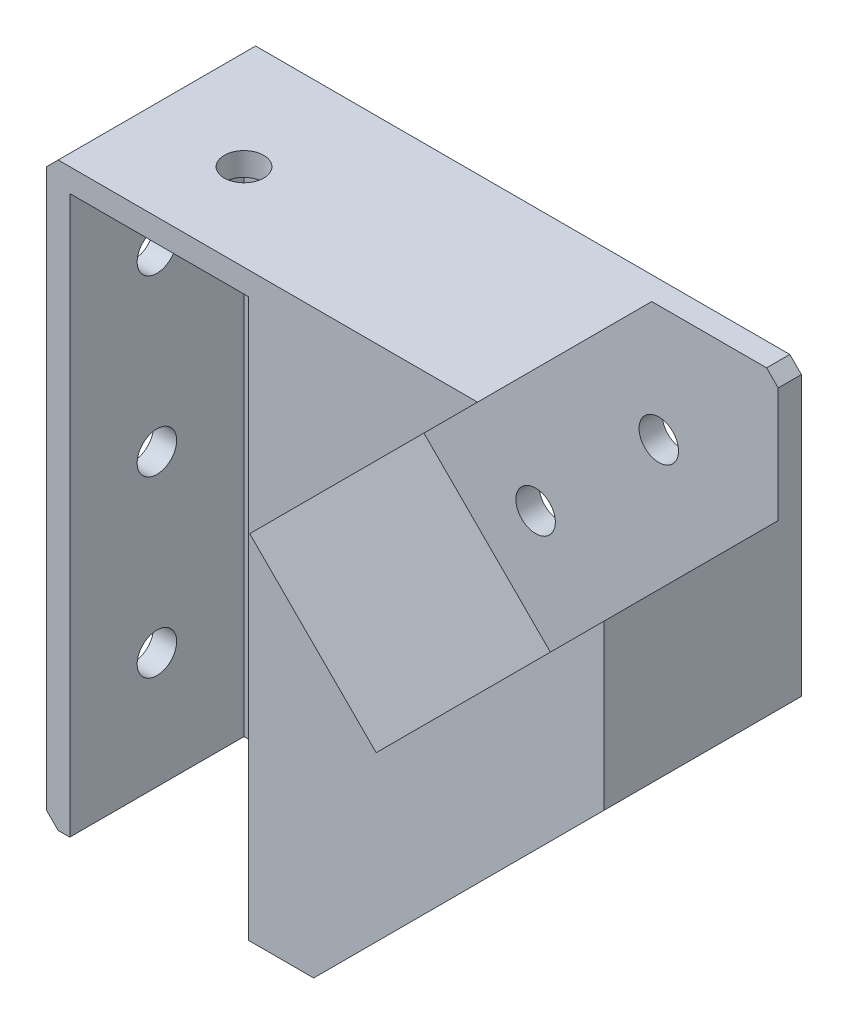
ISO-10303-21;
HEADER;
FILE_DESCRIPTION(('STEP AP214'),'2;1');
FILE_NAME('part.step','',(''),(''),'','','');
FILE_SCHEMA(('AUTOMOTIVE_DESIGN { 1 0 10303 214 1 1 1 1 }'));
ENDSEC;
DATA;
#1=APPLICATION_CONTEXT('core data for automotive mechanical design processes');
#2=APPLICATION_PROTOCOL_DEFINITION('international standard','automotive_design',2000,#1);
#3=PRODUCT_CONTEXT('',#1,'mechanical');
#4=PRODUCT('Part','Part','',(#3));
#5=PRODUCT_RELATED_PRODUCT_CATEGORY('part','',(#4));
#6=PRODUCT_DEFINITION_FORMATION('','',#4);
#7=PRODUCT_DEFINITION_CONTEXT('part definition',#1,'design');
#8=PRODUCT_DEFINITION('design','',#6,#7);
#9=PRODUCT_DEFINITION_SHAPE('','',#8);
#10=(LENGTH_UNIT() NAMED_UNIT(*) SI_UNIT(.MILLI.,.METRE.));
#11=(NAMED_UNIT(*) PLANE_ANGLE_UNIT() SI_UNIT($,.RADIAN.));
#12=(NAMED_UNIT(*) SI_UNIT($,.STERADIAN.) SOLID_ANGLE_UNIT());
#13=UNCERTAINTY_MEASURE_WITH_UNIT(LENGTH_MEASURE(1.E-05),#10,'distance_accuracy_value','');
#14=(GEOMETRIC_REPRESENTATION_CONTEXT(3) GLOBAL_UNCERTAINTY_ASSIGNED_CONTEXT((#13)) GLOBAL_UNIT_ASSIGNED_CONTEXT((#10,
#11,#12)) REPRESENTATION_CONTEXT('',''));
#15=CARTESIAN_POINT('',(0.,0.,0.));
#16=DIRECTION('',(0.,0.,1.));
#17=DIRECTION('',(1.,0.,0.));
#18=AXIS2_PLACEMENT_3D('',#15,#16,#17);
#19=CARTESIAN_POINT('',(24.,15.1105555697272,2.));
#20=DIRECTION('',(0.707106781186548,-0.707106781186547,0.));
#21=DIRECTION('',(0.707106781186547,0.707106781186548,0.));
#22=AXIS2_PLACEMENT_3D('',#19,#20,#21);
#23=PLANE('',#22);
#24=DIRECTION('',(0.707106781186547,0.707106781186548,0.));
#25=VECTOR('',#24,1.);
#26=CARTESIAN_POINT('',(24.,15.1105555697272,17.));
#27=LINE('',#26,#25);
#28=CARTESIAN_POINT('',(4.38153172576223,-4.50791270451062,17.));
#29=VERTEX_POINT('',#28);
#30=CARTESIAN_POINT('',(24.,15.1105555697272,17.));
#31=VERTEX_POINT('',#30);
#32=EDGE_CURVE('E157',#29,#31,#27,.T.);
#33=ORIENTED_EDGE('',*,*,#32,.T.);
#34=DIRECTION('',(0.,0.,1.));
#35=VECTOR('',#34,1.);
#36=CARTESIAN_POINT('',(24.,15.1105555697272,2.));
#37=LINE('',#36,#35);
#38=CARTESIAN_POINT('',(24.,15.1105555697272,2.));
#39=VERTEX_POINT('',#38);
#40=EDGE_CURVE('E192',#39,#31,#37,.T.);
#41=ORIENTED_EDGE('',*,*,#40,.F.);
#42=DIRECTION('',(0.707106781186547,0.707106781186548,0.));
#43=VECTOR('',#42,1.);
#44=CARTESIAN_POINT('',(24.,15.1105555697272,2.));
#45=LINE('',#44,#43);
#46=CARTESIAN_POINT('',(4.38153172576223,-4.50791270451062,2.));
#47=VERTEX_POINT('',#46);
#48=EDGE_CURVE('E178',#47,#39,#45,.T.);
#49=ORIENTED_EDGE('',*,*,#48,.F.);
#50=DIRECTION('',(0.,0.,1.));
#51=VECTOR('',#50,1.);
#52=CARTESIAN_POINT('',(4.38153172576223,-4.50791270451062,2.));
#53=LINE('',#52,#51);
#54=EDGE_CURVE('E176',#47,#29,#53,.T.);
#55=ORIENTED_EDGE('',*,*,#54,.T.);
#56=EDGE_LOOP('',(#33,#41,#49,#55));
#57=FACE_BOUND('',#56,.T.);
#58=CARTESIAN_POINT('',(9.87365440327096,0.984209972998115,9.5));
#59=DIRECTION('',(0.707106781186548,-0.707106781186547,0.));
#60=DIRECTION('',(0.707106781186547,0.707106781186548,0.));
#61=AXIS2_PLACEMENT_3D('',#58,#59,#60);
#62=CIRCLE('',#61,1.7);
#63=CARTESIAN_POINT('',(11.0757359312881,2.18629150101525,9.5));
#64=VERTEX_POINT('',#63);
#65=EDGE_CURVE('E440',#64,#64,#62,.F.);
#66=ORIENTED_EDGE('',*,*,#65,.F.);
#67=EDGE_LOOP('',(#66));
#68=FACE_BOUND('',#67,.T.);
#69=ADVANCED_FACE('F33',(#57,#68),#23,.F.);
#70=CARTESIAN_POINT('',(0.,0.,2.));
#71=DIRECTION('',(0.,0.,1.));
#72=DIRECTION('',(1.,0.,0.));
#73=AXIS2_PLACEMENT_3D('',#70,#71,#72);
#74=PLANE('',#73);
#75=CARTESIAN_POINT('',(-14.5,16.,2.));
#76=DIRECTION('',(0.,0.,1.));
#77=DIRECTION('',(1.,0.,0.));
#78=AXIS2_PLACEMENT_3D('',#75,#76,#77);
#79=CIRCLE('',#78,1.7);
#80=CARTESIAN_POINT('',(-12.8,16.,2.));
#81=VERTEX_POINT('',#80);
#82=EDGE_CURVE('E460',#81,#81,#79,.T.);
#83=ORIENTED_EDGE('',*,*,#82,.F.);
#84=EDGE_LOOP('',(#83));
#85=FACE_BOUND('',#84,.T.);
#86=CARTESIAN_POINT('',(-14.5,0.999999999999996,2.));
#87=DIRECTION('',(0.,0.,1.));
#88=DIRECTION('',(1.,0.,0.));
#89=AXIS2_PLACEMENT_3D('',#86,#87,#88);
#90=CIRCLE('',#89,1.7);
#91=CARTESIAN_POINT('',(-12.8,0.999999999999996,2.));
#92=VERTEX_POINT('',#91);
#93=EDGE_CURVE('E466',#92,#92,#90,.T.);
#94=ORIENTED_EDGE('',*,*,#93,.F.);
#95=EDGE_LOOP('',(#94));
#96=FACE_BOUND('',#95,.T.);
#97=CARTESIAN_POINT('',(-14.5,-14.,2.));
#98=DIRECTION('',(0.,0.,1.));
#99=DIRECTION('',(1.,0.,0.));
#100=AXIS2_PLACEMENT_3D('',#97,#98,#99);
#101=CIRCLE('',#100,1.7);
#102=CARTESIAN_POINT('',(-12.8,-14.,2.));
#103=VERTEX_POINT('',#102);
#104=EDGE_CURVE('E472',#103,#103,#101,.T.);
#105=ORIENTED_EDGE('',*,*,#104,.F.);
#106=EDGE_LOOP('',(#105));
#107=FACE_BOUND('',#106,.T.);
#108=DIRECTION('',(1.,0.,0.));
#109=VECTOR('',#108,1.);
#110=CARTESIAN_POINT('',(-24.,-24.,2.));
#111=LINE('',#110,#109);
#112=CARTESIAN_POINT('',(-22.,-24.,2.));
#113=VERTEX_POINT('',#112);
#114=CARTESIAN_POINT('',(-6.59999999999998,-24.,2.));
#115=VERTEX_POINT('',#114);
#116=EDGE_CURVE('E218',#113,#115,#111,.T.);
#117=ORIENTED_EDGE('',*,*,#116,.T.);
#118=DIRECTION('',(0.,-1.,0.));
#119=VECTOR('',#118,1.);
#120=CARTESIAN_POINT('',(-6.59999999999998,-24.,2.));
#121=LINE('',#120,#119);
#122=CARTESIAN_POINT('',(-6.59999999999998,24.,2.));
#123=VERTEX_POINT('',#122);
#124=EDGE_CURVE('E197',#123,#115,#121,.T.);
#125=ORIENTED_EDGE('',*,*,#124,.F.);
#126=DIRECTION('',(-1.,0.,0.));
#127=VECTOR('',#126,1.);
#128=CARTESIAN_POINT('',(-24.,24.,2.));
#129=LINE('',#128,#127);
#130=CARTESIAN_POINT('',(-22.,24.,2.));
#131=VERTEX_POINT('',#130);
#132=EDGE_CURVE('E230',#123,#131,#129,.T.);
#133=ORIENTED_EDGE('',*,*,#132,.T.);
#134=DIRECTION('',(0.,1.,0.));
#135=VECTOR('',#134,1.);
#136=CARTESIAN_POINT('',(-22.,-24.,2.));
#137=LINE('',#136,#135);
#138=EDGE_CURVE('E203',#113,#131,#137,.T.);
#139=ORIENTED_EDGE('',*,*,#138,.F.);
#140=EDGE_LOOP('',(#117,#125,#133,#139));
#141=FACE_BOUND('',#140,.T.);
#142=ADVANCED_FACE('F304',(#85,#96,#107,#141),#74,.T.);
#143=CARTESIAN_POINT('',(24.,24.,2.));
#144=DIRECTION('',(-1.,0.,0.));
#145=DIRECTION('',(0.,-1.,0.));
#146=AXIS2_PLACEMENT_3D('',#143,#144,#145);
#147=PLANE('',#146);
#148=DIRECTION('',(0.,-1.,0.));
#149=VECTOR('',#148,1.);
#150=CARTESIAN_POINT('',(24.,26.,17.));
#151=LINE('',#150,#149);
#152=CARTESIAN_POINT('',(24.,0.999999999999987,17.));
#153=VERTEX_POINT('',#152);
#154=EDGE_CURVE('E186',#31,#153,#151,.T.);
#155=ORIENTED_EDGE('',*,*,#154,.T.);
#156=DIRECTION('',(0.,0.,-1.));
#157=VECTOR('',#156,1.);
#158=CARTESIAN_POINT('',(24.,0.99999999999999,2.));
#159=LINE('',#158,#157);
#160=CARTESIAN_POINT('',(24.,0.999999999999988,0.));
#161=VERTEX_POINT('',#160);
#162=EDGE_CURVE('E271',#153,#161,#159,.T.);
#163=ORIENTED_EDGE('',*,*,#162,.T.);
#164=DIRECTION('',(0.,1.,0.));
#165=VECTOR('',#164,1.);
#166=CARTESIAN_POINT('',(24.,24.,0.));
#167=LINE('',#166,#165);
#168=CARTESIAN_POINT('',(24.,25.,0.));
#169=VERTEX_POINT('',#168);
#170=EDGE_CURVE('E227',#161,#169,#167,.T.);
#171=ORIENTED_EDGE('',*,*,#170,.T.);
#172=DIRECTION('',(0.,0.,1.));
#173=VECTOR('',#172,1.);
#174=CARTESIAN_POINT('',(24.,25.,2.));
#175=LINE('',#174,#173);
#176=CARTESIAN_POINT('',(24.,25.,2.));
#177=VERTEX_POINT('',#176);
#178=EDGE_CURVE('E251',#169,#177,#175,.T.);
#179=ORIENTED_EDGE('',*,*,#178,.T.);
#180=DIRECTION('',(0.,1.,0.));
#181=VECTOR('',#180,1.);
#182=CARTESIAN_POINT('',(24.,26.,2.));
#183=LINE('',#182,#181);
#184=EDGE_CURVE('E174',#39,#177,#183,.T.);
#185=ORIENTED_EDGE('',*,*,#184,.F.);
#186=ORIENTED_EDGE('',*,*,#40,.T.);
#187=EDGE_LOOP('',(#155,#163,#171,#179,#185,#186));
#188=FACE_BOUND('',#187,.T.);
#189=ADVANCED_FACE('F277',(#188),#147,.F.);
#190=CARTESIAN_POINT('',(-24.,24.,2.));
#191=DIRECTION('',(1.,0.,0.));
#192=DIRECTION('',(0.,1.,0.));
#193=AXIS2_PLACEMENT_3D('',#190,#191,#192);
#194=PLANE('',#193);
#195=CARTESIAN_POINT('',(-24.,-14.,9.5));
#196=DIRECTION('',(-1.,0.,0.));
#197=DIRECTION('',(0.,0.,1.));
#198=AXIS2_PLACEMENT_3D('',#195,#196,#197);
#199=CIRCLE('',#198,1.69999999999999);
#200=CARTESIAN_POINT('',(-24.,-14.,11.2));
#201=VERTEX_POINT('',#200);
#202=EDGE_CURVE('E422',#201,#201,#199,.T.);
#203=ORIENTED_EDGE('',*,*,#202,.F.);
#204=EDGE_LOOP('',(#203));
#205=FACE_BOUND('',#204,.T.);
#206=CARTESIAN_POINT('',(-24.,0.999999999999996,9.5));
#207=DIRECTION('',(-1.,0.,0.));
#208=DIRECTION('',(0.,0.,1.));
#209=AXIS2_PLACEMENT_3D('',#206,#207,#208);
#210=CIRCLE('',#209,1.69999999999999);
#211=CARTESIAN_POINT('',(-24.,0.999999999999996,11.2));
#212=VERTEX_POINT('',#211);
#213=EDGE_CURVE('E425',#212,#212,#210,.T.);
#214=ORIENTED_EDGE('',*,*,#213,.F.);
#215=EDGE_LOOP('',(#214));
#216=FACE_BOUND('',#215,.T.);
#217=CARTESIAN_POINT('',(-24.,16.,9.5));
#218=DIRECTION('',(-1.,0.,0.));
#219=DIRECTION('',(0.,0.,1.));
#220=AXIS2_PLACEMENT_3D('',#217,#218,#219);
#221=CIRCLE('',#220,1.69999999999999);
#222=CARTESIAN_POINT('',(-24.,16.,11.2));
#223=VERTEX_POINT('',#222);
#224=EDGE_CURVE('E433',#223,#223,#221,.T.);
#225=ORIENTED_EDGE('',*,*,#224,.F.);
#226=EDGE_LOOP('',(#225));
#227=FACE_BOUND('',#226,.T.);
#228=DIRECTION('',(0.,-1.,0.));
#229=VECTOR('',#228,1.);
#230=CARTESIAN_POINT('',(-24.,24.,0.));
#231=LINE('',#230,#229);
#232=CARTESIAN_POINT('',(-24.,25.,0.));
#233=VERTEX_POINT('',#232);
#234=CARTESIAN_POINT('',(-24.,-23.,0.));
#235=VERTEX_POINT('',#234);
#236=EDGE_CURVE('E285',#233,#235,#231,.T.);
#237=ORIENTED_EDGE('',*,*,#236,.T.);
#238=DIRECTION('',(0.,0.,1.));
#239=VECTOR('',#238,1.);
#240=CARTESIAN_POINT('',(-24.,-23.,2.));
#241=LINE('',#240,#239);
#242=CARTESIAN_POINT('',(-24.,-23.,17.));
#243=VERTEX_POINT('',#242);
#244=EDGE_CURVE('E267',#235,#243,#241,.T.);
#245=ORIENTED_EDGE('',*,*,#244,.T.);
#246=DIRECTION('',(0.,-1.,0.));
#247=VECTOR('',#246,1.);
#248=CARTESIAN_POINT('',(-24.,-24.,17.));
#249=LINE('',#248,#247);
#250=CARTESIAN_POINT('',(-24.,25.,17.));
#251=VERTEX_POINT('',#250);
#252=EDGE_CURVE('E204',#251,#243,#249,.T.);
#253=ORIENTED_EDGE('',*,*,#252,.F.);
#254=DIRECTION('',(0.,0.,-1.));
#255=VECTOR('',#254,1.);
#256=CARTESIAN_POINT('',(-24.,25.,0.));
#257=LINE('',#256,#255);
#258=EDGE_CURVE('E258',#251,#233,#257,.T.);
#259=ORIENTED_EDGE('',*,*,#258,.T.);
#260=EDGE_LOOP('',(#237,#245,#253,#259));
#261=FACE_BOUND('',#260,.T.);
#262=ADVANCED_FACE('F316',(#205,#216,#227,#261),#194,.F.);
#263=CARTESIAN_POINT('',(-24.,-24.,2.));
#264=DIRECTION('',(0.,1.,0.));
#265=DIRECTION('',(0.,0.,1.));
#266=AXIS2_PLACEMENT_3D('',#263,#264,#265);
#267=PLANE('',#266);
#268=DIRECTION('',(1.,0.,0.));
#269=VECTOR('',#268,1.);
#270=CARTESIAN_POINT('',(-24.,-24.,0.));
#271=LINE('',#270,#269);
#272=CARTESIAN_POINT('',(-23.,-24.,0.));
#273=VERTEX_POINT('',#272);
#274=CARTESIAN_POINT('',(-1.00000000000007,-24.,0.));
#275=VERTEX_POINT('',#274);
#276=EDGE_CURVE('E233',#273,#275,#271,.T.);
#277=ORIENTED_EDGE('',*,*,#276,.T.);
#278=DIRECTION('',(0.,0.,1.));
#279=VECTOR('',#278,1.);
#280=CARTESIAN_POINT('',(-1.00000000000007,-24.,2.));
#281=LINE('',#280,#279);
#282=CARTESIAN_POINT('',(-1.00000000000008,-24.,17.));
#283=VERTEX_POINT('',#282);
#284=EDGE_CURVE('E41',#275,#283,#281,.T.);
#285=ORIENTED_EDGE('',*,*,#284,.T.);
#286=DIRECTION('',(1.,0.,0.));
#287=VECTOR('',#286,1.);
#288=CARTESIAN_POINT('',(-6.59999999999998,-24.,17.));
#289=LINE('',#288,#287);
#290=CARTESIAN_POINT('',(-6.59999999999998,-24.,17.));
#291=VERTEX_POINT('',#290);
#292=EDGE_CURVE('E193',#291,#283,#289,.T.);
#293=ORIENTED_EDGE('',*,*,#292,.F.);
#294=DIRECTION('',(0.,0.,-1.));
#295=VECTOR('',#294,1.);
#296=CARTESIAN_POINT('',(-6.59999999999998,-24.,17.));
#297=LINE('',#296,#295);
#298=EDGE_CURVE('E200',#291,#115,#297,.T.);
#299=ORIENTED_EDGE('',*,*,#298,.T.);
#300=ORIENTED_EDGE('',*,*,#116,.F.);
#301=DIRECTION('',(0.,0.,-1.));
#302=VECTOR('',#301,1.);
#303=CARTESIAN_POINT('',(-22.,-24.,17.));
#304=LINE('',#303,#302);
#305=CARTESIAN_POINT('',(-22.,-24.,17.));
#306=VERTEX_POINT('',#305);
#307=EDGE_CURVE('E222',#306,#113,#304,.T.);
#308=ORIENTED_EDGE('',*,*,#307,.F.);
#309=DIRECTION('',(1.,0.,0.));
#310=VECTOR('',#309,1.);
#311=CARTESIAN_POINT('',(-24.,-24.,17.));
#312=LINE('',#311,#310);
#313=CARTESIAN_POINT('',(-23.,-24.,17.));
#314=VERTEX_POINT('',#313);
#315=EDGE_CURVE('E207',#314,#306,#312,.T.);
#316=ORIENTED_EDGE('',*,*,#315,.F.);
#317=DIRECTION('',(0.,0.,-1.));
#318=VECTOR('',#317,1.);
#319=CARTESIAN_POINT('',(-23.,-24.,2.));
#320=LINE('',#319,#318);
#321=EDGE_CURVE('E262',#314,#273,#320,.T.);
#322=ORIENTED_EDGE('',*,*,#321,.T.);
#323=EDGE_LOOP('',(#277,#285,#293,#299,#300,#308,#316,#322));
#324=FACE_BOUND('',#323,.T.);
#325=ADVANCED_FACE('F290',(#324),#267,.F.);
#326=CARTESIAN_POINT('',(0.,0.,0.));
#327=DIRECTION('',(0.,0.,1.));
#328=DIRECTION('',(1.,0.,0.));
#329=AXIS2_PLACEMENT_3D('',#326,#327,#328);
#330=PLANE('',#329);
#331=CARTESIAN_POINT('',(-14.5,16.,0.));
#332=DIRECTION('',(0.,0.,1.));
#333=DIRECTION('',(1.,0.,0.));
#334=AXIS2_PLACEMENT_3D('',#331,#332,#333);
#335=CIRCLE('',#334,1.7);
#336=CARTESIAN_POINT('',(-12.8,16.,0.));
#337=VERTEX_POINT('',#336);
#338=EDGE_CURVE('E463',#337,#337,#335,.T.);
#339=ORIENTED_EDGE('',*,*,#338,.T.);
#340=EDGE_LOOP('',(#339));
#341=FACE_BOUND('',#340,.T.);
#342=CARTESIAN_POINT('',(-14.5,0.999999999999996,0.));
#343=DIRECTION('',(0.,0.,1.));
#344=DIRECTION('',(1.,0.,0.));
#345=AXIS2_PLACEMENT_3D('',#342,#343,#344);
#346=CIRCLE('',#345,1.7);
#347=CARTESIAN_POINT('',(-12.8,0.999999999999996,0.));
#348=VERTEX_POINT('',#347);
#349=EDGE_CURVE('E469',#348,#348,#346,.T.);
#350=ORIENTED_EDGE('',*,*,#349,.T.);
#351=EDGE_LOOP('',(#350));
#352=FACE_BOUND('',#351,.T.);
#353=CARTESIAN_POINT('',(-14.5,-14.,0.));
#354=DIRECTION('',(0.,0.,1.));
#355=DIRECTION('',(1.,0.,0.));
#356=AXIS2_PLACEMENT_3D('',#353,#354,#355);
#357=CIRCLE('',#356,1.7);
#358=CARTESIAN_POINT('',(-12.8,-14.,0.));
#359=VERTEX_POINT('',#358);
#360=EDGE_CURVE('E475',#359,#359,#357,.T.);
#361=ORIENTED_EDGE('',*,*,#360,.T.);
#362=EDGE_LOOP('',(#361));
#363=FACE_BOUND('',#362,.T.);
#364=CARTESIAN_POINT('',(3.11055556972718,5.39339828220178,0.));
#365=DIRECTION('',(0.,0.,1.));
#366=DIRECTION('',(1.,0.,0.));
#367=AXIS2_PLACEMENT_3D('',#364,#365,#366);
#368=CIRCLE('',#367,1.7);
#369=CARTESIAN_POINT('',(4.81055556972717,5.39339828220178,0.));
#370=VERTEX_POINT('',#369);
#371=EDGE_CURVE('E481',#370,#370,#368,.T.);
#372=ORIENTED_EDGE('',*,*,#371,.T.);
#373=EDGE_LOOP('',(#372));
#374=FACE_BOUND('',#373,.T.);
#375=CARTESIAN_POINT('',(13.7171572875254,16.,0.));
#376=DIRECTION('',(0.,0.,1.));
#377=DIRECTION('',(1.,0.,0.));
#378=AXIS2_PLACEMENT_3D('',#375,#376,#377);
#379=CIRCLE('',#378,1.7);
#380=CARTESIAN_POINT('',(15.4171572875254,16.,0.));
#381=VERTEX_POINT('',#380);
#382=EDGE_CURVE('E334',#381,#381,#379,.T.);
#383=ORIENTED_EDGE('',*,*,#382,.T.);
#384=EDGE_LOOP('',(#383));
#385=FACE_BOUND('',#384,.T.);
#386=ORIENTED_EDGE('',*,*,#170,.F.);
#387=DIRECTION('',(0.707106781186549,0.707106781186546,0.));
#388=VECTOR('',#387,1.);
#389=CARTESIAN_POINT('',(24.,0.99999999999999,0.));
#390=LINE('',#389,#388);
#391=EDGE_CURVE('E55',#161,#275,#390,.F.);
#392=ORIENTED_EDGE('',*,*,#391,.T.);
#393=ORIENTED_EDGE('',*,*,#276,.F.);
#394=DIRECTION('',(0.707106781186545,-0.70710678118655,0.));
#395=VECTOR('',#394,1.);
#396=CARTESIAN_POINT('',(-23.,-24.,0.));
#397=LINE('',#396,#395);
#398=EDGE_CURVE('E265',#273,#235,#397,.F.);
#399=ORIENTED_EDGE('',*,*,#398,.T.);
#400=ORIENTED_EDGE('',*,*,#236,.F.);
#401=DIRECTION('',(0.707106781186548,0.707106781186548,0.));
#402=VECTOR('',#401,1.);
#403=CARTESIAN_POINT('',(-23.,26.,0.));
#404=LINE('',#403,#402);
#405=CARTESIAN_POINT('',(-23.,26.,0.));
#406=VERTEX_POINT('',#405);
#407=EDGE_CURVE('E260',#233,#406,#404,.T.);
#408=ORIENTED_EDGE('',*,*,#407,.T.);
#409=DIRECTION('',(-1.,0.,0.));
#410=VECTOR('',#409,1.);
#411=CARTESIAN_POINT('',(-24.,26.,0.));
#412=LINE('',#411,#410);
#413=CARTESIAN_POINT('',(23.,26.,0.));
#414=VERTEX_POINT('',#413);
#415=EDGE_CURVE('E183',#414,#406,#412,.T.);
#416=ORIENTED_EDGE('',*,*,#415,.F.);
#417=DIRECTION('',(0.707106781186548,-0.707106781186548,0.));
#418=VECTOR('',#417,1.);
#419=CARTESIAN_POINT('',(23.,26.,0.));
#420=LINE('',#419,#418);
#421=EDGE_CURVE('E248',#414,#169,#420,.T.);
#422=ORIENTED_EDGE('',*,*,#421,.T.);
#423=EDGE_LOOP('',(#386,#392,#393,#399,#400,#408,#416,#422));
#424=FACE_BOUND('',#423,.T.);
#425=ADVANCED_FACE('F282',(#341,#352,#363,#374,#385,#424),#330,.F.);
#426=CARTESIAN_POINT('',(-22.,-24.,17.));
#427=DIRECTION('',(-1.,0.,0.));
#428=DIRECTION('',(0.,0.,1.));
#429=AXIS2_PLACEMENT_3D('',#426,#427,#428);
#430=PLANE('',#429);
#431=CARTESIAN_POINT('',(-22.,-14.,9.5));
#432=DIRECTION('',(-1.,0.,0.));
#433=DIRECTION('',(0.,0.,1.));
#434=AXIS2_PLACEMENT_3D('',#431,#432,#433);
#435=CIRCLE('',#434,1.69999999999999);
#436=CARTESIAN_POINT('',(-22.,-14.,11.2));
#437=VERTEX_POINT('',#436);
#438=EDGE_CURVE('E419',#437,#437,#435,.T.);
#439=ORIENTED_EDGE('',*,*,#438,.T.);
#440=EDGE_LOOP('',(#439));
#441=FACE_BOUND('',#440,.T.);
#442=CARTESIAN_POINT('',(-22.,0.999999999999996,9.5));
#443=DIRECTION('',(-1.,0.,0.));
#444=DIRECTION('',(0.,0.,1.));
#445=AXIS2_PLACEMENT_3D('',#442,#443,#444);
#446=CIRCLE('',#445,1.69999999999999);
#447=CARTESIAN_POINT('',(-22.,0.999999999999996,11.2));
#448=VERTEX_POINT('',#447);
#449=EDGE_CURVE('E430',#448,#448,#446,.T.);
#450=ORIENTED_EDGE('',*,*,#449,.T.);
#451=EDGE_LOOP('',(#450));
#452=FACE_BOUND('',#451,.T.);
#453=CARTESIAN_POINT('',(-22.,16.,9.5));
#454=DIRECTION('',(-1.,0.,0.));
#455=DIRECTION('',(0.,0.,1.));
#456=AXIS2_PLACEMENT_3D('',#453,#454,#455);
#457=CIRCLE('',#456,1.69999999999999);
#458=CARTESIAN_POINT('',(-22.,16.,11.2));
#459=VERTEX_POINT('',#458);
#460=EDGE_CURVE('E436',#459,#459,#457,.T.);
#461=ORIENTED_EDGE('',*,*,#460,.T.);
#462=EDGE_LOOP('',(#461));
#463=FACE_BOUND('',#462,.T.);
#464=ORIENTED_EDGE('',*,*,#138,.T.);
#465=DIRECTION('',(0.,0.,-1.));
#466=VECTOR('',#465,1.);
#467=CARTESIAN_POINT('',(-22.,24.,17.));
#468=LINE('',#467,#466);
#469=CARTESIAN_POINT('',(-22.,24.,17.));
#470=VERTEX_POINT('',#469);
#471=EDGE_CURVE('E220',#470,#131,#468,.T.);
#472=ORIENTED_EDGE('',*,*,#471,.F.);
#473=DIRECTION('',(0.,1.,0.));
#474=VECTOR('',#473,1.);
#475=CARTESIAN_POINT('',(-22.,-24.,17.));
#476=LINE('',#475,#474);
#477=EDGE_CURVE('E209',#306,#470,#476,.T.);
#478=ORIENTED_EDGE('',*,*,#477,.F.);
#479=ORIENTED_EDGE('',*,*,#307,.T.);
#480=EDGE_LOOP('',(#464,#472,#478,#479));
#481=FACE_BOUND('',#480,.T.);
#482=ADVANCED_FACE('F307',(#441,#452,#463,#481),#430,.F.);
#483=CARTESIAN_POINT('',(0.,0.,17.));
#484=DIRECTION('',(0.,0.,-1.));
#485=DIRECTION('',(-1.,0.,0.));
#486=AXIS2_PLACEMENT_3D('',#483,#484,#485);
#487=PLANE('',#486);
#488=ORIENTED_EDGE('',*,*,#292,.T.);
#489=DIRECTION('',(-0.707106781186549,-0.707106781186546,0.));
#490=VECTOR('',#489,1.);
#491=CARTESIAN_POINT('',(24.,0.99999999999999,17.));
#492=LINE('',#491,#490);
#493=EDGE_CURVE('E11',#283,#153,#492,.F.);
#494=ORIENTED_EDGE('',*,*,#493,.T.);
#495=ORIENTED_EDGE('',*,*,#154,.F.);
#496=ORIENTED_EDGE('',*,*,#32,.F.);
#497=DIRECTION('',(0.707106781186548,-0.707106781186548,0.));
#498=VECTOR('',#497,1.);
#499=CARTESIAN_POINT('',(4.38153172576223,-4.50791270451062,17.));
#500=LINE('',#499,#498);
#501=CARTESIAN_POINT('',(-6.50791270451061,6.38153172576221,17.));
#502=VERTEX_POINT('',#501);
#503=EDGE_CURVE('E333',#502,#29,#500,.T.);
#504=ORIENTED_EDGE('',*,*,#503,.F.);
#505=DIRECTION('',(-0.707106781186547,-0.707106781186548,0.));
#506=VECTOR('',#505,1.);
#507=CARTESIAN_POINT('',(-6.50791270451061,6.38153172576221,17.));
#508=LINE('',#507,#506);
#509=CARTESIAN_POINT('',(13.1105555697272,26.,17.));
#510=VERTEX_POINT('',#509);
#511=EDGE_CURVE('E331',#510,#502,#508,.T.);
#512=ORIENTED_EDGE('',*,*,#511,.F.);
#513=DIRECTION('',(1.,0.,0.));
#514=VECTOR('',#513,1.);
#515=CARTESIAN_POINT('',(-24.,26.,17.));
#516=LINE('',#515,#514);
#517=CARTESIAN_POINT('',(-23.,26.,17.));
#518=VERTEX_POINT('',#517);
#519=EDGE_CURVE('E173',#518,#510,#516,.T.);
#520=ORIENTED_EDGE('',*,*,#519,.F.);
#521=DIRECTION('',(-0.707106781186548,-0.707106781186548,0.));
#522=VECTOR('',#521,1.);
#523=CARTESIAN_POINT('',(-23.,26.,17.));
#524=LINE('',#523,#522);
#525=EDGE_CURVE('E256',#518,#251,#524,.T.);
#526=ORIENTED_EDGE('',*,*,#525,.T.);
#527=ORIENTED_EDGE('',*,*,#252,.T.);
#528=DIRECTION('',(-0.707106781186545,0.70710678118655,0.));
#529=VECTOR('',#528,1.);
#530=CARTESIAN_POINT('',(-23.,-24.,17.));
#531=LINE('',#530,#529);
#532=EDGE_CURVE('E269',#243,#314,#531,.F.);
#533=ORIENTED_EDGE('',*,*,#532,.T.);
#534=ORIENTED_EDGE('',*,*,#315,.T.);
#535=ORIENTED_EDGE('',*,*,#477,.T.);
#536=DIRECTION('',(1.,0.,0.));
#537=VECTOR('',#536,1.);
#538=CARTESIAN_POINT('',(-24.,24.,17.));
#539=LINE('',#538,#537);
#540=CARTESIAN_POINT('',(-6.59999999999998,24.,17.));
#541=VERTEX_POINT('',#540);
#542=EDGE_CURVE('E184',#470,#541,#539,.T.);
#543=ORIENTED_EDGE('',*,*,#542,.T.);
#544=DIRECTION('',(0.,-1.,0.));
#545=VECTOR('',#544,1.);
#546=CARTESIAN_POINT('',(-6.59999999999998,-24.,17.));
#547=LINE('',#546,#545);
#548=EDGE_CURVE('E196',#541,#291,#547,.T.);
#549=ORIENTED_EDGE('',*,*,#548,.T.);
#550=EDGE_LOOP('',(#488,#494,#495,#496,#504,#512,#520,#526,#527,#533,#534,#535,#543,#549));
#551=FACE_BOUND('',#550,.T.);
#552=ADVANCED_FACE('F294',(#551),#487,.F.);
#553=CARTESIAN_POINT('',(-6.59999999999998,-24.,17.));
#554=DIRECTION('',(1.,0.,0.));
#555=DIRECTION('',(0.,0.,-1.));
#556=AXIS2_PLACEMENT_3D('',#553,#554,#555);
#557=PLANE('',#556);
#558=ORIENTED_EDGE('',*,*,#124,.T.);
#559=ORIENTED_EDGE('',*,*,#298,.F.);
#560=ORIENTED_EDGE('',*,*,#548,.F.);
#561=DIRECTION('',(0.,0.,-1.));
#562=VECTOR('',#561,1.);
#563=CARTESIAN_POINT('',(-6.59999999999998,24.,17.));
#564=LINE('',#563,#562);
#565=EDGE_CURVE('E195',#541,#123,#564,.T.);
#566=ORIENTED_EDGE('',*,*,#565,.T.);
#567=EDGE_LOOP('',(#558,#559,#560,#566));
#568=FACE_BOUND('',#567,.T.);
#569=ADVANCED_FACE('F302',(#568),#557,.F.);
#570=CARTESIAN_POINT('',(0.,24.,0.));
#571=DIRECTION('',(0.,1.,0.));
#572=DIRECTION('',(0.,0.,1.));
#573=AXIS2_PLACEMENT_3D('',#570,#571,#572);
#574=PLANE('',#573);
#575=CARTESIAN_POINT('',(-14.5,24.,9.5));
#576=DIRECTION('',(0.,-1.,0.));
#577=DIRECTION('',(0.,0.,-1.));
#578=AXIS2_PLACEMENT_3D('',#575,#576,#577);
#579=CIRCLE('',#578,1.69999999999999);
#580=CARTESIAN_POINT('',(-14.5,24.,7.80000000000001));
#581=VERTEX_POINT('',#580);
#582=EDGE_CURVE('E443',#581,#581,#579,.T.);
#583=ORIENTED_EDGE('',*,*,#582,.F.);
#584=EDGE_LOOP('',(#583));
#585=FACE_BOUND('',#584,.T.);
#586=ORIENTED_EDGE('',*,*,#542,.F.);
#587=ORIENTED_EDGE('',*,*,#471,.T.);
#588=ORIENTED_EDGE('',*,*,#132,.F.);
#589=ORIENTED_EDGE('',*,*,#565,.F.);
#590=EDGE_LOOP('',(#586,#587,#588,#589));
#591=FACE_BOUND('',#590,.T.);
#592=ADVANCED_FACE('F349',(#585,#591),#574,.F.);
#593=CARTESIAN_POINT('',(0.,26.,0.));
#594=DIRECTION('',(0.,1.,0.));
#595=DIRECTION('',(0.,0.,1.));
#596=AXIS2_PLACEMENT_3D('',#593,#594,#595);
#597=PLANE('',#596);
#598=CARTESIAN_POINT('',(-14.5,26.,9.5));
#599=DIRECTION('',(0.,-1.,0.));
#600=DIRECTION('',(0.,0.,-1.));
#601=AXIS2_PLACEMENT_3D('',#598,#599,#600);
#602=CIRCLE('',#601,1.7);
#603=CARTESIAN_POINT('',(-14.5,26.,7.8));
#604=VERTEX_POINT('',#603);
#605=EDGE_CURVE('E457',#604,#604,#602,.T.);
#606=ORIENTED_EDGE('',*,*,#605,.T.);
#607=EDGE_LOOP('',(#606));
#608=FACE_BOUND('',#607,.T.);
#609=ORIENTED_EDGE('',*,*,#415,.T.);
#610=DIRECTION('',(0.,0.,1.));
#611=VECTOR('',#610,1.);
#612=CARTESIAN_POINT('',(-23.,26.,17.));
#613=LINE('',#612,#611);
#614=EDGE_CURVE('E254',#406,#518,#613,.T.);
#615=ORIENTED_EDGE('',*,*,#614,.T.);
#616=ORIENTED_EDGE('',*,*,#519,.T.);
#617=DIRECTION('',(0.,0.,1.));
#618=VECTOR('',#617,1.);
#619=CARTESIAN_POINT('',(13.1105555697272,26.,2.));
#620=LINE('',#619,#618);
#621=CARTESIAN_POINT('',(13.1105555697272,26.,2.));
#622=VERTEX_POINT('',#621);
#623=EDGE_CURVE('E163',#622,#510,#620,.T.);
#624=ORIENTED_EDGE('',*,*,#623,.F.);
#625=DIRECTION('',(-1.,0.,0.));
#626=VECTOR('',#625,1.);
#627=CARTESIAN_POINT('',(13.1105555697272,26.,2.));
#628=LINE('',#627,#626);
#629=CARTESIAN_POINT('',(23.,26.,2.));
#630=VERTEX_POINT('',#629);
#631=EDGE_CURVE('E145',#630,#622,#628,.T.);
#632=ORIENTED_EDGE('',*,*,#631,.F.);
#633=DIRECTION('',(0.,0.,-1.));
#634=VECTOR('',#633,1.);
#635=CARTESIAN_POINT('',(23.,26.,0.));
#636=LINE('',#635,#634);
#637=EDGE_CURVE('E246',#630,#414,#636,.T.);
#638=ORIENTED_EDGE('',*,*,#637,.T.);
#639=EDGE_LOOP('',(#609,#615,#616,#624,#632,#638));
#640=FACE_BOUND('',#639,.T.);
#641=ADVANCED_FACE('F170',(#608,#640),#597,.T.);
#642=CARTESIAN_POINT('',(4.38153172576223,-4.50791270451062,2.));
#643=DIRECTION('',(-0.707106781186547,-0.707106781186547,0.));
#644=DIRECTION('',(0.707106781186548,-0.707106781186548,0.));
#645=AXIS2_PLACEMENT_3D('',#642,#643,#644);
#646=PLANE('',#645);
#647=ORIENTED_EDGE('',*,*,#503,.T.);
#648=ORIENTED_EDGE('',*,*,#54,.F.);
#649=DIRECTION('',(0.707106781186548,-0.707106781186548,0.));
#650=VECTOR('',#649,1.);
#651=CARTESIAN_POINT('',(4.38153172576223,-4.50791270451062,2.));
#652=LINE('',#651,#650);
#653=CARTESIAN_POINT('',(-6.50791270451061,6.38153172576221,2.));
#654=VERTEX_POINT('',#653);
#655=EDGE_CURVE('E167',#654,#47,#652,.T.);
#656=ORIENTED_EDGE('',*,*,#655,.F.);
#657=DIRECTION('',(0.,0.,1.));
#658=VECTOR('',#657,1.);
#659=CARTESIAN_POINT('',(-6.50791270451061,6.38153172576221,2.));
#660=LINE('',#659,#658);
#661=EDGE_CURVE('E165',#654,#502,#660,.T.);
#662=ORIENTED_EDGE('',*,*,#661,.T.);
#663=EDGE_LOOP('',(#647,#648,#656,#662));
#664=FACE_BOUND('',#663,.T.);
#665=ADVANCED_FACE('F341',(#664),#646,.F.);
#666=CARTESIAN_POINT('',(-6.50791270451061,6.38153172576221,2.));
#667=DIRECTION('',(-0.707106781186548,0.707106781186547,0.));
#668=DIRECTION('',(-0.707106781186547,-0.707106781186548,0.));
#669=AXIS2_PLACEMENT_3D('',#666,#667,#668);
#670=PLANE('',#669);
#671=ORIENTED_EDGE('',*,*,#511,.T.);
#672=ORIENTED_EDGE('',*,*,#661,.F.);
#673=DIRECTION('',(-0.707106781186547,-0.707106781186548,0.));
#674=VECTOR('',#673,1.);
#675=CARTESIAN_POINT('',(-6.50791270451061,6.38153172576221,2.));
#676=LINE('',#675,#674);
#677=EDGE_CURVE('E150',#622,#654,#676,.T.);
#678=ORIENTED_EDGE('',*,*,#677,.F.);
#679=ORIENTED_EDGE('',*,*,#623,.T.);
#680=EDGE_LOOP('',(#671,#672,#678,#679));
#681=FACE_BOUND('',#680,.T.);
#682=ADVANCED_FACE('F162',(#681),#670,.F.);
#683=CARTESIAN_POINT('',(0.,0.,2.));
#684=DIRECTION('',(0.,0.,-1.));
#685=DIRECTION('',(-1.,0.,0.));
#686=AXIS2_PLACEMENT_3D('',#683,#684,#685);
#687=PLANE('',#686);
#688=CARTESIAN_POINT('',(3.11055556972718,5.39339828220178,2.));
#689=DIRECTION('',(0.,0.,1.));
#690=DIRECTION('',(1.,0.,0.));
#691=AXIS2_PLACEMENT_3D('',#688,#689,#690);
#692=CIRCLE('',#691,1.7);
#693=CARTESIAN_POINT('',(4.81055556972717,5.39339828220178,2.));
#694=VERTEX_POINT('',#693);
#695=EDGE_CURVE('E478',#694,#694,#692,.T.);
#696=ORIENTED_EDGE('',*,*,#695,.F.);
#697=EDGE_LOOP('',(#696));
#698=FACE_BOUND('',#697,.T.);
#699=CARTESIAN_POINT('',(13.7171572875254,16.,2.));
#700=DIRECTION('',(0.,0.,1.));
#701=DIRECTION('',(1.,0.,0.));
#702=AXIS2_PLACEMENT_3D('',#699,#700,#701);
#703=CIRCLE('',#702,1.7);
#704=CARTESIAN_POINT('',(15.4171572875254,16.,2.));
#705=VERTEX_POINT('',#704);
#706=EDGE_CURVE('E484',#705,#705,#703,.T.);
#707=ORIENTED_EDGE('',*,*,#706,.F.);
#708=EDGE_LOOP('',(#707));
#709=FACE_BOUND('',#708,.T.);
#710=ORIENTED_EDGE('',*,*,#184,.T.);
#711=DIRECTION('',(-0.707106781186548,0.707106781186548,0.));
#712=VECTOR('',#711,1.);
#713=CARTESIAN_POINT('',(23.,26.,2.));
#714=LINE('',#713,#712);
#715=EDGE_CURVE('E152',#177,#630,#714,.T.);
#716=ORIENTED_EDGE('',*,*,#715,.T.);
#717=ORIENTED_EDGE('',*,*,#631,.T.);
#718=ORIENTED_EDGE('',*,*,#677,.T.);
#719=ORIENTED_EDGE('',*,*,#655,.T.);
#720=ORIENTED_EDGE('',*,*,#48,.T.);
#721=EDGE_LOOP('',(#710,#716,#717,#718,#719,#720));
#722=FACE_BOUND('',#721,.T.);
#723=ADVANCED_FACE('F148',(#698,#709,#722),#687,.F.);
#724=CARTESIAN_POINT('',(13.7171572875254,16.,2.));
#725=DIRECTION('',(0.,0.,1.));
#726=DIRECTION('',(1.,0.,0.));
#727=AXIS2_PLACEMENT_3D('',#724,#725,#726);
#728=CYLINDRICAL_SURFACE('',#727,1.7);
#729=ORIENTED_EDGE('',*,*,#382,.F.);
#730=EDGE_LOOP('',(#729));
#731=FACE_BOUND('',#730,.T.);
#732=ORIENTED_EDGE('',*,*,#706,.T.);
#733=EDGE_LOOP('',(#732));
#734=FACE_BOUND('',#733,.T.);
#735=ADVANCED_FACE('F362',(#731,#734),#728,.F.);
#736=CARTESIAN_POINT('',(3.11055556972718,5.39339828220178,2.));
#737=DIRECTION('',(0.,0.,1.));
#738=DIRECTION('',(1.,0.,0.));
#739=AXIS2_PLACEMENT_3D('',#736,#737,#738);
#740=CYLINDRICAL_SURFACE('',#739,1.7);
#741=ORIENTED_EDGE('',*,*,#371,.F.);
#742=EDGE_LOOP('',(#741));
#743=FACE_BOUND('',#742,.T.);
#744=ORIENTED_EDGE('',*,*,#695,.T.);
#745=EDGE_LOOP('',(#744));
#746=FACE_BOUND('',#745,.T.);
#747=ADVANCED_FACE('F366',(#743,#746),#740,.F.);
#748=CARTESIAN_POINT('',(-14.5,-14.,2.));
#749=DIRECTION('',(0.,0.,1.));
#750=DIRECTION('',(1.,0.,0.));
#751=AXIS2_PLACEMENT_3D('',#748,#749,#750);
#752=CYLINDRICAL_SURFACE('',#751,1.7);
#753=ORIENTED_EDGE('',*,*,#360,.F.);
#754=EDGE_LOOP('',(#753));
#755=FACE_BOUND('',#754,.T.);
#756=ORIENTED_EDGE('',*,*,#104,.T.);
#757=EDGE_LOOP('',(#756));
#758=FACE_BOUND('',#757,.T.);
#759=ADVANCED_FACE('F370',(#755,#758),#752,.F.);
#760=CARTESIAN_POINT('',(-14.5,0.999999999999996,2.));
#761=DIRECTION('',(0.,0.,1.));
#762=DIRECTION('',(1.,0.,0.));
#763=AXIS2_PLACEMENT_3D('',#760,#761,#762);
#764=CYLINDRICAL_SURFACE('',#763,1.7);
#765=ORIENTED_EDGE('',*,*,#349,.F.);
#766=EDGE_LOOP('',(#765));
#767=FACE_BOUND('',#766,.T.);
#768=ORIENTED_EDGE('',*,*,#93,.T.);
#769=EDGE_LOOP('',(#768));
#770=FACE_BOUND('',#769,.T.);
#771=ADVANCED_FACE('F374',(#767,#770),#764,.F.);
#772=CARTESIAN_POINT('',(-14.5,16.,2.));
#773=DIRECTION('',(0.,0.,1.));
#774=DIRECTION('',(1.,0.,0.));
#775=AXIS2_PLACEMENT_3D('',#772,#773,#774);
#776=CYLINDRICAL_SURFACE('',#775,1.7);
#777=ORIENTED_EDGE('',*,*,#338,.F.);
#778=EDGE_LOOP('',(#777));
#779=FACE_BOUND('',#778,.T.);
#780=ORIENTED_EDGE('',*,*,#82,.T.);
#781=EDGE_LOOP('',(#780));
#782=FACE_BOUND('',#781,.T.);
#783=ADVANCED_FACE('F378',(#779,#782),#776,.F.);
#784=CARTESIAN_POINT('',(23.,26.,0.));
#785=DIRECTION('',(0.707106781186547,0.707106781186547,0.));
#786=DIRECTION('',(0.,0.,1.));
#787=AXIS2_PLACEMENT_3D('',#784,#785,#786);
#788=PLANE('',#787);
#789=ORIENTED_EDGE('',*,*,#715,.F.);
#790=ORIENTED_EDGE('',*,*,#178,.F.);
#791=ORIENTED_EDGE('',*,*,#421,.F.);
#792=ORIENTED_EDGE('',*,*,#637,.F.);
#793=EDGE_LOOP('',(#789,#790,#791,#792));
#794=FACE_BOUND('',#793,.T.);
#795=ADVANCED_FACE('F323',(#794),#788,.T.);
#796=CARTESIAN_POINT('',(-23.,26.,0.));
#797=DIRECTION('',(-0.707106781186547,0.707106781186547,0.));
#798=DIRECTION('',(0.,0.,-1.));
#799=AXIS2_PLACEMENT_3D('',#796,#797,#798);
#800=PLANE('',#799);
#801=ORIENTED_EDGE('',*,*,#407,.F.);
#802=ORIENTED_EDGE('',*,*,#258,.F.);
#803=ORIENTED_EDGE('',*,*,#525,.F.);
#804=ORIENTED_EDGE('',*,*,#614,.F.);
#805=EDGE_LOOP('',(#801,#802,#803,#804));
#806=FACE_BOUND('',#805,.T.);
#807=ADVANCED_FACE('F320',(#806),#800,.T.);
#808=CARTESIAN_POINT('',(-23.,-24.,2.));
#809=DIRECTION('',(0.70710678118655,0.707106781186545,0.));
#810=DIRECTION('',(0.,0.,-1.));
#811=AXIS2_PLACEMENT_3D('',#808,#809,#810);
#812=PLANE('',#811);
#813=ORIENTED_EDGE('',*,*,#532,.F.);
#814=ORIENTED_EDGE('',*,*,#244,.F.);
#815=ORIENTED_EDGE('',*,*,#398,.F.);
#816=ORIENTED_EDGE('',*,*,#321,.F.);
#817=EDGE_LOOP('',(#813,#814,#815,#816));
#818=FACE_BOUND('',#817,.T.);
#819=ADVANCED_FACE('F311',(#818),#812,.F.);
#820=CARTESIAN_POINT('',(-14.5,24.,9.5));
#821=DIRECTION('',(0.,-1.,0.));
#822=DIRECTION('',(0.,0.,-1.));
#823=AXIS2_PLACEMENT_3D('',#820,#821,#822);
#824=CYLINDRICAL_SURFACE('',#823,1.69999999999999);
#825=ORIENTED_EDGE('',*,*,#605,.F.);
#826=EDGE_LOOP('',(#825));
#827=FACE_BOUND('',#826,.T.);
#828=ORIENTED_EDGE('',*,*,#582,.T.);
#829=EDGE_LOOP('',(#828));
#830=FACE_BOUND('',#829,.T.);
#831=ADVANCED_FACE('F383',(#827,#830),#824,.F.);
#832=CARTESIAN_POINT('',(24.,0.99999999999999,2.));
#833=DIRECTION('',(-0.707106781186546,0.707106781186549,0.));
#834=DIRECTION('',(0.,0.,-1.));
#835=AXIS2_PLACEMENT_3D('',#832,#833,#834);
#836=PLANE('',#835);
#837=CARTESIAN_POINT('',(16.9289321881345,-6.07106781186547,9.5));
#838=DIRECTION('',(0.707106781186546,-0.707106781186549,0.));
#839=DIRECTION('',(0.707106781186549,0.707106781186546,0.));
#840=AXIS2_PLACEMENT_3D('',#837,#838,#839);
#841=CIRCLE('',#840,4.5);
#842=CARTESIAN_POINT('',(20.110912703474,-2.88908729652601,9.5));
#843=VERTEX_POINT('',#842);
#844=EDGE_CURVE('E439',#843,#843,#841,.T.);
#845=ORIENTED_EDGE('',*,*,#844,.F.);
#846=EDGE_LOOP('',(#845));
#847=FACE_BOUND('',#846,.T.);
#848=ORIENTED_EDGE('',*,*,#493,.F.);
#849=ORIENTED_EDGE('',*,*,#284,.F.);
#850=ORIENTED_EDGE('',*,*,#391,.F.);
#851=ORIENTED_EDGE('',*,*,#162,.F.);
#852=EDGE_LOOP('',(#848,#849,#850,#851));
#853=FACE_BOUND('',#852,.T.);
#854=ADVANCED_FACE('F35',(#847,#853),#836,.F.);
#855=CARTESIAN_POINT('',(16.9289321881345,-6.07106781186547,9.5));
#856=DIRECTION('',(0.707106781186546,-0.707106781186549,0.));
#857=DIRECTION('',(0.707106781186549,0.707106781186546,0.));
#858=AXIS2_PLACEMENT_3D('',#855,#856,#857);
#859=CYLINDRICAL_SURFACE('',#858,1.7);
#860=ORIENTED_EDGE('',*,*,#65,.T.);
#861=EDGE_LOOP('',(#860));
#862=FACE_BOUND('',#861,.T.);
#863=CARTESIAN_POINT('',(11.5195653120574,-0.661700935788374,9.5));
#864=DIRECTION('',(0.707106781186546,-0.707106781186549,0.));
#865=DIRECTION('',(0.707106781186549,0.707106781186546,0.));
#866=AXIS2_PLACEMENT_3D('',#863,#864,#865);
#867=CIRCLE('',#866,1.7);
#868=CARTESIAN_POINT('',(12.7216468400746,0.540380592228755,9.5));
#869=VERTEX_POINT('',#868);
#870=EDGE_CURVE('E444',#869,#869,#867,.T.);
#871=ORIENTED_EDGE('',*,*,#870,.T.);
#872=EDGE_LOOP('',(#871));
#873=FACE_BOUND('',#872,.T.);
#874=ADVANCED_FACE('F387',(#862,#873),#859,.F.);
#875=CARTESIAN_POINT('',(11.5195653120574,-0.661700935788374,11.2));
#876=DIRECTION('',(-0.707106781186546,0.707106781186549,0.));
#877=DIRECTION('',(-0.707106781186549,-0.707106781186546,0.));
#878=AXIS2_PLACEMENT_3D('',#875,#876,#877);
#879=PLANE('',#878);
#880=ORIENTED_EDGE('',*,*,#870,.F.);
#881=EDGE_LOOP('',(#880));
#882=FACE_BOUND('',#881,.T.);
#883=CARTESIAN_POINT('',(11.5195653120574,-0.661700935788374,9.5));
#884=DIRECTION('',(0.707106781186546,-0.707106781186549,0.));
#885=DIRECTION('',(0.707106781186549,0.707106781186546,0.));
#886=AXIS2_PLACEMENT_3D('',#883,#884,#885);
#887=CIRCLE('',#886,3.35);
#888=CARTESIAN_POINT('',(13.8883730290324,1.70710678118656,9.5));
#889=VERTEX_POINT('',#888);
#890=EDGE_CURVE('E450',#889,#889,#887,.T.);
#891=ORIENTED_EDGE('',*,*,#890,.T.);
#892=EDGE_LOOP('',(#891));
#893=FACE_BOUND('',#892,.T.);
#894=ADVANCED_FACE('F390',(#882,#893),#879,.F.);
#895=CARTESIAN_POINT('',(16.9289321881345,-6.07106781186547,9.5));
#896=DIRECTION('',(0.707106781186546,-0.707106781186549,0.));
#897=DIRECTION('',(0.707106781186549,0.707106781186546,0.));
#898=AXIS2_PLACEMENT_3D('',#895,#896,#897);
#899=CYLINDRICAL_SURFACE('',#898,3.35);
#900=ORIENTED_EDGE('',*,*,#890,.F.);
#901=EDGE_LOOP('',(#900));
#902=FACE_BOUND('',#901,.T.);
#903=CARTESIAN_POINT('',(15.9934838912845,-5.13561951501542,9.5));
#904=DIRECTION('',(0.707106781186546,-0.707106781186549,0.));
#905=DIRECTION('',(0.707106781186549,0.707106781186546,0.));
#906=AXIS2_PLACEMENT_3D('',#903,#904,#905);
#907=CIRCLE('',#906,3.35);
#908=CARTESIAN_POINT('',(18.3622916082594,-2.76681179804049,9.5));
#909=VERTEX_POINT('',#908);
#910=EDGE_CURVE('E447',#909,#909,#907,.T.);
#911=ORIENTED_EDGE('',*,*,#910,.T.);
#912=EDGE_LOOP('',(#911));
#913=FACE_BOUND('',#912,.T.);
#914=ADVANCED_FACE('F394',(#902,#913),#899,.F.);
#915=CARTESIAN_POINT('',(16.9289321881345,-6.07106781186547,9.5));
#916=DIRECTION('',(0.707106781186546,-0.707106781186549,0.));
#917=DIRECTION('',(0.707106781186549,0.707106781186546,0.));
#918=AXIS2_PLACEMENT_3D('',#915,#916,#917);
#919=CONICAL_SURFACE('',#918,4.5,0.715584993317675);
#920=ORIENTED_EDGE('',*,*,#910,.F.);
#921=EDGE_LOOP('',(#920));
#922=FACE_BOUND('',#921,.T.);
#923=ORIENTED_EDGE('',*,*,#844,.T.);
#924=EDGE_LOOP('',(#923));
#925=FACE_BOUND('',#924,.T.);
#926=ADVANCED_FACE('F398',(#922,#925),#919,.F.);
#927=CARTESIAN_POINT('',(-24.,16.,9.5));
#928=DIRECTION('',(-1.,0.,0.));
#929=DIRECTION('',(0.,0.,1.));
#930=AXIS2_PLACEMENT_3D('',#927,#928,#929);
#931=CYLINDRICAL_SURFACE('',#930,1.69999999999999);
#932=ORIENTED_EDGE('',*,*,#460,.F.);
#933=EDGE_LOOP('',(#932));
#934=FACE_BOUND('',#933,.T.);
#935=ORIENTED_EDGE('',*,*,#224,.T.);
#936=EDGE_LOOP('',(#935));
#937=FACE_BOUND('',#936,.T.);
#938=ADVANCED_FACE('F402',(#934,#937),#931,.F.);
#939=CARTESIAN_POINT('',(-24.,0.999999999999996,9.5));
#940=DIRECTION('',(-1.,0.,0.));
#941=DIRECTION('',(0.,0.,1.));
#942=AXIS2_PLACEMENT_3D('',#939,#940,#941);
#943=CYLINDRICAL_SURFACE('',#942,1.69999999999999);
#944=ORIENTED_EDGE('',*,*,#449,.F.);
#945=EDGE_LOOP('',(#944));
#946=FACE_BOUND('',#945,.T.);
#947=ORIENTED_EDGE('',*,*,#213,.T.);
#948=EDGE_LOOP('',(#947));
#949=FACE_BOUND('',#948,.T.);
#950=ADVANCED_FACE('F406',(#946,#949),#943,.F.);
#951=CARTESIAN_POINT('',(-24.,-14.,9.5));
#952=DIRECTION('',(-1.,0.,0.));
#953=DIRECTION('',(0.,0.,1.));
#954=AXIS2_PLACEMENT_3D('',#951,#952,#953);
#955=CYLINDRICAL_SURFACE('',#954,1.69999999999999);
#956=ORIENTED_EDGE('',*,*,#438,.F.);
#957=EDGE_LOOP('',(#956));
#958=FACE_BOUND('',#957,.T.);
#959=ORIENTED_EDGE('',*,*,#202,.T.);
#960=EDGE_LOOP('',(#959));
#961=FACE_BOUND('',#960,.T.);
#962=ADVANCED_FACE('F410',(#958,#961),#955,.F.);
#963=CLOSED_SHELL('',(#69,#142,#189,#262,#325,#425,#482,#552,#569,#592,#641,#665,#682,#723,#735,
#747,#759,#771,#783,#795,#807,#819,#831,#854,#874,#894,#914,#926,#938,#950,#962));
#964=MANIFOLD_SOLID_BREP('B2',#963);
#965=ADVANCED_BREP_SHAPE_REPRESENTATION('',(#18,#964),#14);
#966=SHAPE_DEFINITION_REPRESENTATION(#9,#965);
ENDSEC;
END-ISO-10303-21;
